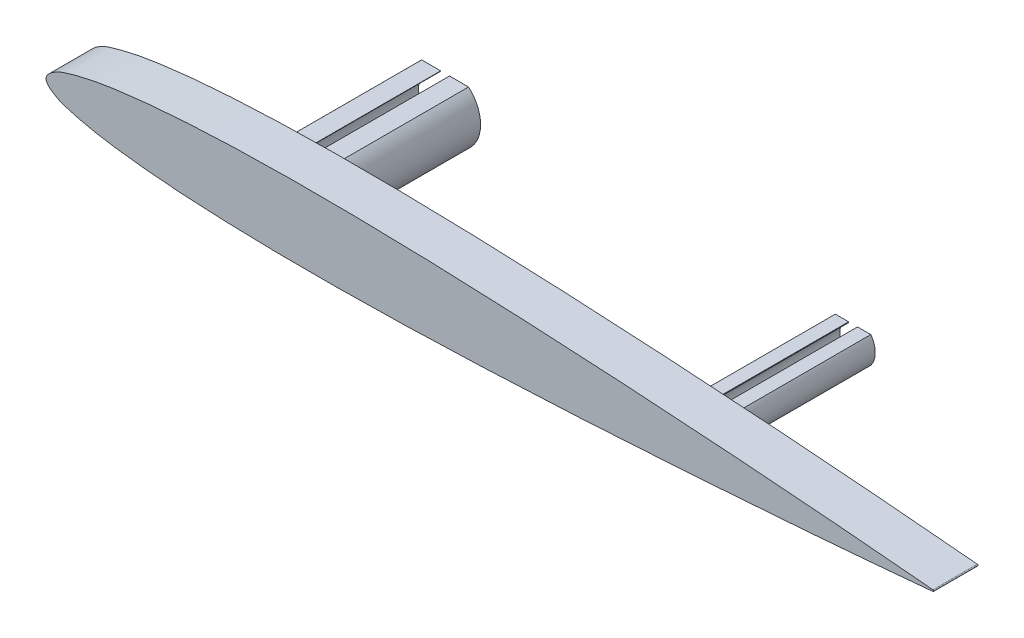
ISO-10303-21;
HEADER;
FILE_DESCRIPTION(('STEP AP214'),'2;1');
FILE_NAME('part.step','',(''),(''),'','','');
FILE_SCHEMA(('AUTOMOTIVE_DESIGN { 1 0 10303 214 1 1 1 1 }'));
ENDSEC;
DATA;
#1=APPLICATION_CONTEXT('core data for automotive mechanical design processes');
#2=APPLICATION_PROTOCOL_DEFINITION('international standard','automotive_design',2000,#1);
#3=PRODUCT_CONTEXT('',#1,'mechanical');
#4=PRODUCT('Part','Part','',(#3));
#5=PRODUCT_RELATED_PRODUCT_CATEGORY('part','',(#4));
#6=PRODUCT_DEFINITION_FORMATION('','',#4);
#7=PRODUCT_DEFINITION_CONTEXT('part definition',#1,'design');
#8=PRODUCT_DEFINITION('design','',#6,#7);
#9=PRODUCT_DEFINITION_SHAPE('','',#8);
#10=(LENGTH_UNIT() NAMED_UNIT(*) SI_UNIT(.MILLI.,.METRE.));
#11=(NAMED_UNIT(*) PLANE_ANGLE_UNIT() SI_UNIT($,.RADIAN.));
#12=(NAMED_UNIT(*) SI_UNIT($,.STERADIAN.) SOLID_ANGLE_UNIT());
#13=UNCERTAINTY_MEASURE_WITH_UNIT(LENGTH_MEASURE(1.E-05),#10,'distance_accuracy_value','');
#14=(GEOMETRIC_REPRESENTATION_CONTEXT(3) GLOBAL_UNCERTAINTY_ASSIGNED_CONTEXT((#13)) GLOBAL_UNIT_ASSIGNED_CONTEXT((#10,
#11,#12)) REPRESENTATION_CONTEXT('',''));
#15=CARTESIAN_POINT('',(0.,0.,0.));
#16=DIRECTION('',(0.,0.,1.));
#17=DIRECTION('',(1.,0.,0.));
#18=AXIS2_PLACEMENT_3D('',#15,#16,#17);
#19=CARTESIAN_POINT('',(0.,0.,0.));
#20=DIRECTION('',(0.,0.,-1.));
#21=DIRECTION('',(-1.,0.,0.));
#22=AXIS2_PLACEMENT_3D('',#19,#20,#21);
#23=PLANE('',#22);
#24=CARTESIAN_POINT('',(25.,0.,0.));
#25=DIRECTION('',(0.,0.,1.));
#26=DIRECTION('',(1.,0.,0.));
#27=AXIS2_PLACEMENT_3D('',#24,#25,#26);
#28=CIRCLE('',#27,4.);
#29=CARTESIAN_POINT('',(27.6457513110646,-3.,0.));
#30=VERTEX_POINT('',#29);
#31=CARTESIAN_POINT('',(27.6457513110646,3.,0.));
#32=VERTEX_POINT('',#31);
#33=EDGE_CURVE('E242',#30,#32,#28,.T.);
#34=ORIENTED_EDGE('',*,*,#33,.T.);
#35=DIRECTION('',(-1.,0.,0.));
#36=VECTOR('',#35,1.);
#37=CARTESIAN_POINT('',(25.5,3.,0.));
#38=LINE('',#37,#36);
#39=CARTESIAN_POINT('',(25.5,3.,0.));
#40=VERTEX_POINT('',#39);
#41=EDGE_CURVE('E211',#32,#40,#38,.T.);
#42=ORIENTED_EDGE('',*,*,#41,.T.);
#43=DIRECTION('',(0.,-1.,0.));
#44=VECTOR('',#43,1.);
#45=CARTESIAN_POINT('',(25.5,2.95803989154981,0.));
#46=LINE('',#45,#44);
#47=CARTESIAN_POINT('',(25.5,2.95803989154981,0.));
#48=VERTEX_POINT('',#47);
#49=EDGE_CURVE('E245',#40,#48,#46,.T.);
#50=ORIENTED_EDGE('',*,*,#49,.T.);
#51=CARTESIAN_POINT('',(25.,0.,0.));
#52=DIRECTION('',(0.,0.,-1.));
#53=DIRECTION('',(1.,0.,0.));
#54=AXIS2_PLACEMENT_3D('',#51,#52,#53);
#55=CIRCLE('',#54,3.);
#56=CARTESIAN_POINT('',(25.5,-2.95803989154981,0.));
#57=VERTEX_POINT('',#56);
#58=EDGE_CURVE('E247',#48,#57,#55,.T.);
#59=ORIENTED_EDGE('',*,*,#58,.T.);
#60=DIRECTION('',(0.,-1.,0.));
#61=VECTOR('',#60,1.);
#62=CARTESIAN_POINT('',(25.5,-3.,0.));
#63=LINE('',#62,#61);
#64=CARTESIAN_POINT('',(25.5,-3.,0.));
#65=VERTEX_POINT('',#64);
#66=EDGE_CURVE('E53',#57,#65,#63,.T.);
#67=ORIENTED_EDGE('',*,*,#66,.T.);
#68=DIRECTION('',(1.,0.,0.));
#69=VECTOR('',#68,1.);
#70=CARTESIAN_POINT('',(25.5,-3.,0.));
#71=LINE('',#70,#69);
#72=EDGE_CURVE('E48',#65,#30,#71,.T.);
#73=ORIENTED_EDGE('',*,*,#72,.T.);
#74=EDGE_LOOP('',(#34,#42,#50,#59,#67,#73));
#75=FACE_BOUND('',#74,.T.);
#76=CARTESIAN_POINT('',(25.,0.,0.));
#77=DIRECTION('',(0.,0.,-1.));
#78=DIRECTION('',(1.,0.,0.));
#79=AXIS2_PLACEMENT_3D('',#76,#77,#78);
#80=CIRCLE('',#79,3.);
#81=CARTESIAN_POINT('',(24.5,-2.95803989154981,0.));
#82=VERTEX_POINT('',#81);
#83=CARTESIAN_POINT('',(24.5,2.95803989154981,0.));
#84=VERTEX_POINT('',#83);
#85=EDGE_CURVE('E251',#82,#84,#80,.T.);
#86=ORIENTED_EDGE('',*,*,#85,.T.);
#87=DIRECTION('',(0.,1.,0.));
#88=VECTOR('',#87,1.);
#89=CARTESIAN_POINT('',(24.5,2.95803989154981,0.));
#90=LINE('',#89,#88);
#91=CARTESIAN_POINT('',(24.5,3.,0.));
#92=VERTEX_POINT('',#91);
#93=EDGE_CURVE('E282',#84,#92,#90,.T.);
#94=ORIENTED_EDGE('',*,*,#93,.T.);
#95=DIRECTION('',(-1.,0.,0.));
#96=VECTOR('',#95,1.);
#97=CARTESIAN_POINT('',(22.3542486889354,3.,0.));
#98=LINE('',#97,#96);
#99=CARTESIAN_POINT('',(22.3542486889354,3.,0.));
#100=VERTEX_POINT('',#99);
#101=EDGE_CURVE('E284',#92,#100,#98,.T.);
#102=ORIENTED_EDGE('',*,*,#101,.T.);
#103=CARTESIAN_POINT('',(25.,0.,0.));
#104=DIRECTION('',(0.,0.,1.));
#105=DIRECTION('',(1.,0.,0.));
#106=AXIS2_PLACEMENT_3D('',#103,#104,#105);
#107=CIRCLE('',#106,4.);
#108=CARTESIAN_POINT('',(22.3542486889354,-3.,0.));
#109=VERTEX_POINT('',#108);
#110=EDGE_CURVE('E286',#100,#109,#107,.T.);
#111=ORIENTED_EDGE('',*,*,#110,.T.);
#112=DIRECTION('',(1.,0.,0.));
#113=VECTOR('',#112,1.);
#114=CARTESIAN_POINT('',(22.3542486889354,-3.,0.));
#115=LINE('',#114,#113);
#116=CARTESIAN_POINT('',(24.5,-3.,0.));
#117=VERTEX_POINT('',#116);
#118=EDGE_CURVE('E288',#109,#117,#115,.T.);
#119=ORIENTED_EDGE('',*,*,#118,.T.);
#120=DIRECTION('',(0.,1.,0.));
#121=VECTOR('',#120,1.);
#122=CARTESIAN_POINT('',(24.5,-3.,0.));
#123=LINE('',#122,#121);
#124=EDGE_CURVE('E265',#117,#82,#123,.T.);
#125=ORIENTED_EDGE('',*,*,#124,.T.);
#126=EDGE_LOOP('',(#86,#94,#102,#111,#119,#125));
#127=FACE_BOUND('',#126,.T.);
#128=CARTESIAN_POINT('',(100.,0.084,0.));
#129=CARTESIAN_POINT('',(98.333488814933,0.236746480055364,0.));
#130=CARTESIAN_POINT('',(95.0011947254255,0.542172688557606,0.));
#131=CARTESIAN_POINT('',(88.3355596211879,1.11089898015662,0.));
#132=CARTESIAN_POINT('',(80.0032933562199,1.76361099520967,0.));
#133=CARTESIAN_POINT('',(70.0029989334555,2.45786169254404,0.));
#134=CARTESIAN_POINT('',(60.0031046254057,3.06174772348002,0.));
#135=CARTESIAN_POINT('',(50.0030086005351,3.55213921170033,0.));
#136=CARTESIAN_POINT('',(40.0025985576922,3.90294649372571,0.));
#137=CARTESIAN_POINT('',(31.666961485844,4.02526015065941,0.));
#138=CARTESIAN_POINT('',(24.9991546003269,3.97693379087482,0.));
#139=CARTESIAN_POINT('',(19.9977755867835,3.84497639830756,0.));
#140=CARTESIAN_POINT('',(14.9933631314586,3.59248695861782,0.));
#141=CARTESIAN_POINT('',(10.8271840648808,3.23765157891607,0.));
#142=CARTESIAN_POINT('',(7.48905438800269,2.81402136675529,0.));
#143=CARTESIAN_POINT('',(4.99359465012965,2.40367305928858,0.));
#144=CARTESIAN_POINT('',(2.84962633983361,1.86792549429032,0.));
#145=CARTESIAN_POINT('',(1.16541350274339,1.32098725183071,0.));
#146=CARTESIAN_POINT('',(-0.664613784127027,0.,0.));
#147=CARTESIAN_POINT('',(1.16541350274339,-1.32098725183071,0.));
#148=CARTESIAN_POINT('',(2.84962633983362,-1.86792549429032,0.));
#149=CARTESIAN_POINT('',(4.99359465012963,-2.40367305928857,0.));
#150=CARTESIAN_POINT('',(7.48905438800269,-2.81402136675529,0.));
#151=CARTESIAN_POINT('',(10.8271840648809,-3.23765157891607,0.));
#152=CARTESIAN_POINT('',(14.9933631314586,-3.59248695861782,0.));
#153=CARTESIAN_POINT('',(19.9977755867835,-3.84497639830756,0.));
#154=CARTESIAN_POINT('',(24.9991546003269,-3.97693379087482,0.));
#155=CARTESIAN_POINT('',(31.666961485844,-4.02526015065941,0.));
#156=CARTESIAN_POINT('',(40.0025985576922,-3.90294649372571,0.));
#157=CARTESIAN_POINT('',(50.0030086005351,-3.55213921170033,0.));
#158=CARTESIAN_POINT('',(60.0031046254058,-3.06174772348002,0.));
#159=CARTESIAN_POINT('',(70.0029989334555,-2.45786169254404,0.));
#160=CARTESIAN_POINT('',(80.0032933562199,-1.76361099520967,0.));
#161=CARTESIAN_POINT('',(88.3355596211879,-1.11089898015662,0.));
#162=CARTESIAN_POINT('',(95.0011947254255,-0.542172688557605,0.));
#163=CARTESIAN_POINT('',(98.333488814933,-0.236746480055364,0.));
#164=CARTESIAN_POINT('',(100.,-0.084,0.));
#165=B_SPLINE_CURVE_WITH_KNOTS('',3,(#128,#129,#130,#131,#132,#133,#134,#135,#136,#137,#138,
#139,#140,#141,#142,#143,#144,#145,#146,#147,#148,#149,#150,#151,#152,#153,#154,#155,#156,#157,
#158,#159,#160,#161,#162,#163,#164),.UNSPECIFIED.,.F.,.F.,(4,1,1,1,1,1,1,1,1,1,1,1,1,1,1,1,1,1,
1,1,1,1,1,1,1,1,1,1,1,1,1,1,1,1,4),(0.,0.0248762929189861,0.0497417146704998,0.0994434021110951,
0.149112224036195,0.198750974066913,0.248359097492202,0.297937369716024,0.347491327096237,
0.37226694027957,0.39705092368842,0.421859474838904,0.446731345826762,0.459220451479859,
0.471790601601357,0.484560454432956,0.491195112481227,0.5,0.508804887518773,0.515439545567044,
0.528209398398643,0.540779548520141,0.553268654173238,0.578140525161096,0.60294907631158,
0.62773305972043,0.652508672903763,0.702062630283976,0.751640902507798,0.801249025933086,
0.850887775963805,0.900556597888905,0.9502582853295,0.975123707081014,1.),.UNSPECIFIED.);
#166=CARTESIAN_POINT('',(100.,0.084,0.));
#167=VERTEX_POINT('',#166);
#168=CARTESIAN_POINT('',(100.,-0.084,0.));
#169=VERTEX_POINT('',#168);
#170=EDGE_CURVE('E393',#167,#169,#165,.T.);
#171=ORIENTED_EDGE('',*,*,#170,.F.);
#172=CARTESIAN_POINT('',(100.,0.,0.));
#173=DIRECTION('',(0.,0.,1.));
#174=DIRECTION('',(-1.,0.,0.));
#175=AXIS2_PLACEMENT_3D('',#172,#173,#174);
#176=CIRCLE('',#175,0.084);
#177=EDGE_CURVE('E401',#169,#167,#176,.T.);
#178=ORIENTED_EDGE('',*,*,#177,.F.);
#179=EDGE_LOOP('',(#171,#178));
#180=FACE_BOUND('',#179,.T.);
#181=DIRECTION('',(1.,0.,0.));
#182=VECTOR('',#181,1.);
#183=CARTESIAN_POINT('',(69.,1.5,0.));
#184=LINE('',#183,#182);
#185=CARTESIAN_POINT('',(69.,1.5,0.));
#186=VERTEX_POINT('',#185);
#187=CARTESIAN_POINT('',(70.5,1.5,0.));
#188=VERTEX_POINT('',#187);
#189=EDGE_CURVE('E369',#186,#188,#184,.T.);
#190=ORIENTED_EDGE('',*,*,#189,.F.);
#191=CARTESIAN_POINT('',(71.,0.,0.));
#192=DIRECTION('',(0.,0.,-1.));
#193=DIRECTION('',(-1.,0.,0.));
#194=AXIS2_PLACEMENT_3D('',#191,#192,#193);
#195=CIRCLE('',#194,2.5);
#196=CARTESIAN_POINT('',(69.,-1.5,0.));
#197=VERTEX_POINT('',#196);
#198=EDGE_CURVE('E351',#197,#186,#195,.T.);
#199=ORIENTED_EDGE('',*,*,#198,.F.);
#200=DIRECTION('',(-1.,0.,0.));
#201=VECTOR('',#200,1.);
#202=CARTESIAN_POINT('',(69.,-1.5,0.));
#203=LINE('',#202,#201);
#204=CARTESIAN_POINT('',(70.5,-1.5,0.));
#205=VERTEX_POINT('',#204);
#206=EDGE_CURVE('E356',#205,#197,#203,.T.);
#207=ORIENTED_EDGE('',*,*,#206,.F.);
#208=DIRECTION('',(0.,-1.,0.));
#209=VECTOR('',#208,1.);
#210=CARTESIAN_POINT('',(70.5,-1.5,0.));
#211=LINE('',#210,#209);
#212=CARTESIAN_POINT('',(70.5,-1.41421356237309,0.));
#213=VERTEX_POINT('',#212);
#214=EDGE_CURVE('E375',#213,#205,#211,.T.);
#215=ORIENTED_EDGE('',*,*,#214,.F.);
#216=CARTESIAN_POINT('',(71.,0.,0.));
#217=DIRECTION('',(0.,0.,1.));
#218=DIRECTION('',(-1.,0.,0.));
#219=AXIS2_PLACEMENT_3D('',#216,#217,#218);
#220=CIRCLE('',#219,1.5);
#221=CARTESIAN_POINT('',(70.5,1.41421356237309,0.));
#222=VERTEX_POINT('',#221);
#223=EDGE_CURVE('E373',#222,#213,#220,.T.);
#224=ORIENTED_EDGE('',*,*,#223,.F.);
#225=DIRECTION('',(0.,-1.,0.));
#226=VECTOR('',#225,1.);
#227=CARTESIAN_POINT('',(70.5,1.41421356237309,0.));
#228=LINE('',#227,#226);
#229=EDGE_CURVE('E371',#188,#222,#228,.T.);
#230=ORIENTED_EDGE('',*,*,#229,.F.);
#231=EDGE_LOOP('',(#190,#199,#207,#215,#224,#230));
#232=FACE_BOUND('',#231,.T.);
#233=CARTESIAN_POINT('',(71.,0.,0.));
#234=DIRECTION('',(0.,0.,-1.));
#235=DIRECTION('',(-1.,0.,0.));
#236=AXIS2_PLACEMENT_3D('',#233,#234,#235);
#237=CIRCLE('',#236,2.5);
#238=CARTESIAN_POINT('',(73.,1.5,0.));
#239=VERTEX_POINT('',#238);
#240=CARTESIAN_POINT('',(73.,-1.5,0.));
#241=VERTEX_POINT('',#240);
#242=EDGE_CURVE('E326',#239,#241,#237,.T.);
#243=ORIENTED_EDGE('',*,*,#242,.F.);
#244=DIRECTION('',(1.,0.,0.));
#245=VECTOR('',#244,1.);
#246=CARTESIAN_POINT('',(71.5,1.5,0.));
#247=LINE('',#246,#245);
#248=CARTESIAN_POINT('',(71.5,1.5,0.));
#249=VERTEX_POINT('',#248);
#250=EDGE_CURVE('E294',#249,#239,#247,.T.);
#251=ORIENTED_EDGE('',*,*,#250,.F.);
#252=DIRECTION('',(1.61771349781083E-13,1.,0.));
#253=VECTOR('',#252,1.);
#254=CARTESIAN_POINT('',(71.5,1.4142135623731,0.));
#255=LINE('',#254,#253);
#256=CARTESIAN_POINT('',(71.5,1.4142135623731,0.));
#257=VERTEX_POINT('',#256);
#258=EDGE_CURVE('E313',#257,#249,#255,.T.);
#259=ORIENTED_EDGE('',*,*,#258,.F.);
#260=CARTESIAN_POINT('',(71.,0.,0.));
#261=DIRECTION('',(0.,0.,1.));
#262=DIRECTION('',(-1.,0.,0.));
#263=AXIS2_PLACEMENT_3D('',#260,#261,#262);
#264=CIRCLE('',#263,1.5);
#265=CARTESIAN_POINT('',(71.5,-1.4142135623731,0.));
#266=VERTEX_POINT('',#265);
#267=EDGE_CURVE('E332',#266,#257,#264,.T.);
#268=ORIENTED_EDGE('',*,*,#267,.F.);
#269=DIRECTION('',(0.,1.,0.));
#270=VECTOR('',#269,1.);
#271=CARTESIAN_POINT('',(71.5,-1.5,0.));
#272=LINE('',#271,#270);
#273=CARTESIAN_POINT('',(71.5,-1.5,0.));
#274=VERTEX_POINT('',#273);
#275=EDGE_CURVE('E330',#274,#266,#272,.T.);
#276=ORIENTED_EDGE('',*,*,#275,.F.);
#277=DIRECTION('',(-1.,0.,0.));
#278=VECTOR('',#277,1.);
#279=CARTESIAN_POINT('',(71.5,-1.5,0.));
#280=LINE('',#279,#278);
#281=EDGE_CURVE('E328',#241,#274,#280,.T.);
#282=ORIENTED_EDGE('',*,*,#281,.F.);
#283=EDGE_LOOP('',(#243,#251,#259,#268,#276,#282));
#284=FACE_BOUND('',#283,.T.);
#285=ADVANCED_FACE('F32',(#75,#127,#180,#232,#284),#23,.T.);
#286=CARTESIAN_POINT('',(100.,0.084,5.));
#287=CARTESIAN_POINT('',(98.333488814933,0.236746480055364,5.));
#288=CARTESIAN_POINT('',(95.0011947254255,0.542172688557606,5.));
#289=CARTESIAN_POINT('',(88.3355596211879,1.11089898015662,5.));
#290=CARTESIAN_POINT('',(80.0032933562199,1.76361099520967,5.));
#291=CARTESIAN_POINT('',(70.0029989334555,2.45786169254404,5.));
#292=CARTESIAN_POINT('',(60.0031046254057,3.06174772348002,5.));
#293=CARTESIAN_POINT('',(50.0030086005351,3.55213921170033,5.));
#294=CARTESIAN_POINT('',(40.0025985576922,3.90294649372571,5.));
#295=CARTESIAN_POINT('',(31.666961485844,4.02526015065941,5.));
#296=CARTESIAN_POINT('',(24.9991546003269,3.97693379087482,5.));
#297=CARTESIAN_POINT('',(19.9977755867835,3.84497639830756,5.));
#298=CARTESIAN_POINT('',(14.9933631314586,3.59248695861782,5.));
#299=CARTESIAN_POINT('',(10.8271840648808,3.23765157891607,5.));
#300=CARTESIAN_POINT('',(7.48905438800269,2.81402136675529,5.));
#301=CARTESIAN_POINT('',(4.99359465012965,2.40367305928858,5.));
#302=CARTESIAN_POINT('',(2.84962633983361,1.86792549429032,5.));
#303=CARTESIAN_POINT('',(1.16541350274339,1.32098725183071,5.));
#304=CARTESIAN_POINT('',(-0.664613784127027,0.,5.));
#305=CARTESIAN_POINT('',(1.16541350274339,-1.32098725183071,5.));
#306=CARTESIAN_POINT('',(2.84962633983362,-1.86792549429032,5.));
#307=CARTESIAN_POINT('',(4.99359465012963,-2.40367305928857,5.));
#308=CARTESIAN_POINT('',(7.48905438800269,-2.81402136675529,5.));
#309=CARTESIAN_POINT('',(10.8271840648809,-3.23765157891607,5.));
#310=CARTESIAN_POINT('',(14.9933631314586,-3.59248695861782,5.));
#311=CARTESIAN_POINT('',(19.9977755867835,-3.84497639830756,5.));
#312=CARTESIAN_POINT('',(24.9991546003269,-3.97693379087482,5.));
#313=CARTESIAN_POINT('',(31.666961485844,-4.02526015065941,5.));
#314=CARTESIAN_POINT('',(40.0025985576922,-3.90294649372571,5.));
#315=CARTESIAN_POINT('',(50.0030086005351,-3.55213921170033,5.));
#316=CARTESIAN_POINT('',(60.0031046254058,-3.06174772348002,5.));
#317=CARTESIAN_POINT('',(70.0029989334555,-2.45786169254404,5.));
#318=CARTESIAN_POINT('',(80.0032933562199,-1.76361099520967,5.));
#319=CARTESIAN_POINT('',(88.3355596211879,-1.11089898015662,5.));
#320=CARTESIAN_POINT('',(95.0011947254255,-0.542172688557605,5.));
#321=CARTESIAN_POINT('',(98.333488814933,-0.236746480055364,5.));
#322=CARTESIAN_POINT('',(100.,-0.084,5.));
#323=B_SPLINE_CURVE_WITH_KNOTS('',3,(#286,#287,#288,#289,#290,#291,#292,#293,#294,#295,#296,
#297,#298,#299,#300,#301,#302,#303,#304,#305,#306,#307,#308,#309,#310,#311,#312,#313,#314,#315,
#316,#317,#318,#319,#320,#321,#322),.UNSPECIFIED.,.F.,.F.,(4,1,1,1,1,1,1,1,1,1,1,1,1,1,1,1,1,1,
1,1,1,1,1,1,1,1,1,1,1,1,1,1,1,1,4),(0.,0.0248762929189861,0.0497417146704998,0.0994434021110951,
0.149112224036195,0.198750974066913,0.248359097492202,0.297937369716024,0.347491327096237,
0.37226694027957,0.39705092368842,0.421859474838904,0.446731345826762,0.459220451479859,
0.471790601601357,0.484560454432956,0.491195112481227,0.5,0.508804887518773,0.515439545567044,
0.528209398398643,0.540779548520141,0.553268654173238,0.578140525161096,0.60294907631158,
0.62773305972043,0.652508672903763,0.702062630283976,0.751640902507798,0.801249025933086,
0.850887775963805,0.900556597888905,0.9502582853295,0.975123707081014,1.),.UNSPECIFIED.);
#324=DIRECTION('',(0.,0.,-1.));
#325=VECTOR('',#324,1.);
#326=SURFACE_OF_LINEAR_EXTRUSION('',#323,#325);
#327=ORIENTED_EDGE('',*,*,#170,.T.);
#328=DIRECTION('',(0.,0.,-1.));
#329=VECTOR('',#328,1.);
#330=CARTESIAN_POINT('',(100.,-0.084,5.));
#331=LINE('',#330,#329);
#332=CARTESIAN_POINT('',(100.,-0.084,5.));
#333=VERTEX_POINT('',#332);
#334=EDGE_CURVE('E11',#333,#169,#331,.T.);
#335=ORIENTED_EDGE('',*,*,#334,.F.);
#336=CARTESIAN_POINT('',(100.,0.084,5.));
#337=VERTEX_POINT('',#336);
#338=EDGE_CURVE('E394',#337,#333,#323,.T.);
#339=ORIENTED_EDGE('',*,*,#338,.F.);
#340=DIRECTION('',(0.,0.,-1.));
#341=VECTOR('',#340,1.);
#342=CARTESIAN_POINT('',(100.,0.084,5.));
#343=LINE('',#342,#341);
#344=EDGE_CURVE('E41',#337,#167,#343,.T.);
#345=ORIENTED_EDGE('',*,*,#344,.T.);
#346=EDGE_LOOP('',(#327,#335,#339,#345));
#347=FACE_BOUND('',#346,.T.);
#348=ADVANCED_FACE('F34',(#347),#326,.F.);
#349=CARTESIAN_POINT('',(100.,0.,5.));
#350=DIRECTION('',(0.,0.,-1.));
#351=DIRECTION('',(-1.,0.,0.));
#352=AXIS2_PLACEMENT_3D('',#349,#350,#351);
#353=CYLINDRICAL_SURFACE('',#352,0.084);
#354=ORIENTED_EDGE('',*,*,#177,.T.);
#355=ORIENTED_EDGE('',*,*,#344,.F.);
#356=CARTESIAN_POINT('',(100.,0.,5.));
#357=DIRECTION('',(0.,0.,1.));
#358=DIRECTION('',(-1.,0.,0.));
#359=AXIS2_PLACEMENT_3D('',#356,#357,#358);
#360=CIRCLE('',#359,0.084);
#361=EDGE_CURVE('E400',#333,#337,#360,.T.);
#362=ORIENTED_EDGE('',*,*,#361,.F.);
#363=ORIENTED_EDGE('',*,*,#334,.T.);
#364=EDGE_LOOP('',(#354,#355,#362,#363));
#365=FACE_BOUND('',#364,.T.);
#366=ADVANCED_FACE('F422',(#365),#353,.T.);
#367=CARTESIAN_POINT('',(0.,0.,5.));
#368=DIRECTION('',(0.,0.,-1.));
#369=DIRECTION('',(-1.,0.,0.));
#370=AXIS2_PLACEMENT_3D('',#367,#368,#369);
#371=PLANE('',#370);
#372=ORIENTED_EDGE('',*,*,#338,.T.);
#373=ORIENTED_EDGE('',*,*,#361,.T.);
#374=EDGE_LOOP('',(#372,#373));
#375=FACE_BOUND('',#374,.T.);
#376=ADVANCED_FACE('F424',(#375),#371,.F.);
#377=CARTESIAN_POINT('',(71.,0.,-15.));
#378=DIRECTION('',(0.,0.,1.));
#379=DIRECTION('',(1.,0.,0.));
#380=AXIS2_PLACEMENT_3D('',#377,#378,#379);
#381=CYLINDRICAL_SURFACE('',#380,2.5);
#382=ORIENTED_EDGE('',*,*,#198,.T.);
#383=DIRECTION('',(0.,0.,1.));
#384=VECTOR('',#383,1.);
#385=CARTESIAN_POINT('',(69.,1.5,-15.));
#386=LINE('',#385,#384);
#387=CARTESIAN_POINT('',(69.,1.5,-15.));
#388=VERTEX_POINT('',#387);
#389=EDGE_CURVE('E392',#388,#186,#386,.T.);
#390=ORIENTED_EDGE('',*,*,#389,.F.);
#391=CARTESIAN_POINT('',(71.,0.,-15.));
#392=DIRECTION('',(0.,0.,-1.));
#393=DIRECTION('',(-1.,0.,0.));
#394=AXIS2_PLACEMENT_3D('',#391,#392,#393);
#395=CIRCLE('',#394,2.5);
#396=CARTESIAN_POINT('',(69.,-1.5,-15.));
#397=VERTEX_POINT('',#396);
#398=EDGE_CURVE('E352',#397,#388,#395,.T.);
#399=ORIENTED_EDGE('',*,*,#398,.F.);
#400=DIRECTION('',(0.,0.,1.));
#401=VECTOR('',#400,1.);
#402=CARTESIAN_POINT('',(69.,-1.5,-15.));
#403=LINE('',#402,#401);
#404=EDGE_CURVE('E366',#397,#197,#403,.T.);
#405=ORIENTED_EDGE('',*,*,#404,.T.);
#406=EDGE_LOOP('',(#382,#390,#399,#405));
#407=FACE_BOUND('',#406,.T.);
#408=ADVANCED_FACE('F426',(#407),#381,.T.);
#409=CARTESIAN_POINT('',(69.,1.5,-15.));
#410=DIRECTION('',(0.,-1.,0.));
#411=DIRECTION('',(1.,0.,0.));
#412=AXIS2_PLACEMENT_3D('',#409,#410,#411);
#413=PLANE('',#412);
#414=ORIENTED_EDGE('',*,*,#189,.T.);
#415=DIRECTION('',(0.,0.,1.));
#416=VECTOR('',#415,1.);
#417=CARTESIAN_POINT('',(70.5,1.5,-15.));
#418=LINE('',#417,#416);
#419=CARTESIAN_POINT('',(70.5,1.5,-15.));
#420=VERTEX_POINT('',#419);
#421=EDGE_CURVE('E389',#420,#188,#418,.T.);
#422=ORIENTED_EDGE('',*,*,#421,.F.);
#423=DIRECTION('',(1.,0.,0.));
#424=VECTOR('',#423,1.);
#425=CARTESIAN_POINT('',(69.,1.5,-15.));
#426=LINE('',#425,#424);
#427=EDGE_CURVE('E355',#388,#420,#426,.T.);
#428=ORIENTED_EDGE('',*,*,#427,.F.);
#429=ORIENTED_EDGE('',*,*,#389,.T.);
#430=EDGE_LOOP('',(#414,#422,#428,#429));
#431=FACE_BOUND('',#430,.T.);
#432=ADVANCED_FACE('F432',(#431),#413,.F.);
#433=CARTESIAN_POINT('',(70.5,1.41421356237309,-15.));
#434=DIRECTION('',(-1.,0.,0.));
#435=DIRECTION('',(0.,0.,1.));
#436=AXIS2_PLACEMENT_3D('',#433,#434,#435);
#437=PLANE('',#436);
#438=ORIENTED_EDGE('',*,*,#229,.T.);
#439=DIRECTION('',(0.,0.,1.));
#440=VECTOR('',#439,1.);
#441=CARTESIAN_POINT('',(70.5,1.41421356237309,-15.));
#442=LINE('',#441,#440);
#443=CARTESIAN_POINT('',(70.5,1.41421356237309,-15.));
#444=VERTEX_POINT('',#443);
#445=EDGE_CURVE('E386',#444,#222,#442,.T.);
#446=ORIENTED_EDGE('',*,*,#445,.F.);
#447=DIRECTION('',(0.,-1.,0.));
#448=VECTOR('',#447,1.);
#449=CARTESIAN_POINT('',(70.5,1.41421356237309,-15.));
#450=LINE('',#449,#448);
#451=EDGE_CURVE('E358',#420,#444,#450,.T.);
#452=ORIENTED_EDGE('',*,*,#451,.F.);
#453=ORIENTED_EDGE('',*,*,#421,.T.);
#454=EDGE_LOOP('',(#438,#446,#452,#453));
#455=FACE_BOUND('',#454,.T.);
#456=ADVANCED_FACE('F531',(#455),#437,.F.);
#457=CARTESIAN_POINT('',(71.,0.,-15.));
#458=DIRECTION('',(0.,0.,1.));
#459=DIRECTION('',(1.,0.,0.));
#460=AXIS2_PLACEMENT_3D('',#457,#458,#459);
#461=CYLINDRICAL_SURFACE('',#460,1.5);
#462=ORIENTED_EDGE('',*,*,#223,.T.);
#463=DIRECTION('',(0.,0.,1.));
#464=VECTOR('',#463,1.);
#465=CARTESIAN_POINT('',(70.5,-1.41421356237309,-15.));
#466=LINE('',#465,#464);
#467=CARTESIAN_POINT('',(70.5,-1.41421356237309,-15.));
#468=VERTEX_POINT('',#467);
#469=EDGE_CURVE('E383',#468,#213,#466,.T.);
#470=ORIENTED_EDGE('',*,*,#469,.F.);
#471=CARTESIAN_POINT('',(71.,0.,-15.));
#472=DIRECTION('',(0.,0.,1.));
#473=DIRECTION('',(-1.,0.,0.));
#474=AXIS2_PLACEMENT_3D('',#471,#472,#473);
#475=CIRCLE('',#474,1.5);
#476=EDGE_CURVE('E360',#444,#468,#475,.T.);
#477=ORIENTED_EDGE('',*,*,#476,.F.);
#478=ORIENTED_EDGE('',*,*,#445,.T.);
#479=EDGE_LOOP('',(#462,#470,#477,#478));
#480=FACE_BOUND('',#479,.T.);
#481=ADVANCED_FACE('F527',(#480),#461,.F.);
#482=CARTESIAN_POINT('',(70.5,-1.5,-15.));
#483=DIRECTION('',(-1.,0.,0.));
#484=DIRECTION('',(0.,0.,1.));
#485=AXIS2_PLACEMENT_3D('',#482,#483,#484);
#486=PLANE('',#485);
#487=ORIENTED_EDGE('',*,*,#214,.T.);
#488=DIRECTION('',(0.,0.,1.));
#489=VECTOR('',#488,1.);
#490=CARTESIAN_POINT('',(70.5,-1.5,-15.));
#491=LINE('',#490,#489);
#492=CARTESIAN_POINT('',(70.5,-1.5,-15.));
#493=VERTEX_POINT('',#492);
#494=EDGE_CURVE('E381',#493,#205,#491,.T.);
#495=ORIENTED_EDGE('',*,*,#494,.F.);
#496=DIRECTION('',(0.,-1.,0.));
#497=VECTOR('',#496,1.);
#498=CARTESIAN_POINT('',(70.5,-1.5,-15.));
#499=LINE('',#498,#497);
#500=EDGE_CURVE('E362',#468,#493,#499,.T.);
#501=ORIENTED_EDGE('',*,*,#500,.F.);
#502=ORIENTED_EDGE('',*,*,#469,.T.);
#503=EDGE_LOOP('',(#487,#495,#501,#502));
#504=FACE_BOUND('',#503,.T.);
#505=ADVANCED_FACE('F523',(#504),#486,.F.);
#506=CARTESIAN_POINT('',(69.,-1.5,-15.));
#507=DIRECTION('',(0.,1.,0.));
#508=DIRECTION('',(0.,0.,1.));
#509=AXIS2_PLACEMENT_3D('',#506,#507,#508);
#510=PLANE('',#509);
#511=ORIENTED_EDGE('',*,*,#206,.T.);
#512=ORIENTED_EDGE('',*,*,#404,.F.);
#513=DIRECTION('',(-1.,0.,0.));
#514=VECTOR('',#513,1.);
#515=CARTESIAN_POINT('',(69.,-1.5,-15.));
#516=LINE('',#515,#514);
#517=EDGE_CURVE('E364',#493,#397,#516,.T.);
#518=ORIENTED_EDGE('',*,*,#517,.F.);
#519=ORIENTED_EDGE('',*,*,#494,.T.);
#520=EDGE_LOOP('',(#511,#512,#518,#519));
#521=FACE_BOUND('',#520,.T.);
#522=ADVANCED_FACE('F519',(#521),#510,.F.);
#523=CARTESIAN_POINT('',(71.,0.,-15.));
#524=DIRECTION('',(0.,0.,-1.));
#525=DIRECTION('',(-1.,0.,0.));
#526=AXIS2_PLACEMENT_3D('',#523,#524,#525);
#527=PLANE('',#526);
#528=ORIENTED_EDGE('',*,*,#398,.T.);
#529=ORIENTED_EDGE('',*,*,#427,.T.);
#530=ORIENTED_EDGE('',*,*,#451,.T.);
#531=ORIENTED_EDGE('',*,*,#476,.T.);
#532=ORIENTED_EDGE('',*,*,#500,.T.);
#533=ORIENTED_EDGE('',*,*,#517,.T.);
#534=EDGE_LOOP('',(#528,#529,#530,#531,#532,#533));
#535=FACE_BOUND('',#534,.T.);
#536=ADVANCED_FACE('F515',(#535),#527,.T.);
#537=CARTESIAN_POINT('',(71.5,1.5,-15.));
#538=DIRECTION('',(0.,-1.,0.));
#539=DIRECTION('',(1.,0.,0.));
#540=AXIS2_PLACEMENT_3D('',#537,#538,#539);
#541=PLANE('',#540);
#542=ORIENTED_EDGE('',*,*,#250,.T.);
#543=DIRECTION('',(0.,0.,1.));
#544=VECTOR('',#543,1.);
#545=CARTESIAN_POINT('',(73.,1.5,-15.));
#546=LINE('',#545,#544);
#547=CARTESIAN_POINT('',(73.,1.5,-15.));
#548=VERTEX_POINT('',#547);
#549=EDGE_CURVE('E349',#548,#239,#546,.T.);
#550=ORIENTED_EDGE('',*,*,#549,.F.);
#551=DIRECTION('',(1.,0.,0.));
#552=VECTOR('',#551,1.);
#553=CARTESIAN_POINT('',(71.5,1.5,-15.));
#554=LINE('',#553,#552);
#555=CARTESIAN_POINT('',(71.5,1.5,-15.));
#556=VERTEX_POINT('',#555);
#557=EDGE_CURVE('E309',#556,#548,#554,.T.);
#558=ORIENTED_EDGE('',*,*,#557,.F.);
#559=DIRECTION('',(0.,0.,1.));
#560=VECTOR('',#559,1.);
#561=CARTESIAN_POINT('',(71.5,1.5,-15.));
#562=LINE('',#561,#560);
#563=EDGE_CURVE('E323',#556,#249,#562,.T.);
#564=ORIENTED_EDGE('',*,*,#563,.T.);
#565=EDGE_LOOP('',(#542,#550,#558,#564));
#566=FACE_BOUND('',#565,.T.);
#567=ADVANCED_FACE('F511',(#566),#541,.F.);
#568=CARTESIAN_POINT('',(71.,0.,-15.));
#569=DIRECTION('',(0.,0.,1.));
#570=DIRECTION('',(1.,0.,0.));
#571=AXIS2_PLACEMENT_3D('',#568,#569,#570);
#572=CYLINDRICAL_SURFACE('',#571,2.5);
#573=ORIENTED_EDGE('',*,*,#242,.T.);
#574=DIRECTION('',(0.,0.,1.));
#575=VECTOR('',#574,1.);
#576=CARTESIAN_POINT('',(73.,-1.5,-15.));
#577=LINE('',#576,#575);
#578=CARTESIAN_POINT('',(73.,-1.5,-15.));
#579=VERTEX_POINT('',#578);
#580=EDGE_CURVE('E346',#579,#241,#577,.T.);
#581=ORIENTED_EDGE('',*,*,#580,.F.);
#582=CARTESIAN_POINT('',(71.,0.,-15.));
#583=DIRECTION('',(0.,0.,-1.));
#584=DIRECTION('',(-1.,0.,0.));
#585=AXIS2_PLACEMENT_3D('',#582,#583,#584);
#586=CIRCLE('',#585,2.5);
#587=EDGE_CURVE('E312',#548,#579,#586,.T.);
#588=ORIENTED_EDGE('',*,*,#587,.F.);
#589=ORIENTED_EDGE('',*,*,#549,.T.);
#590=EDGE_LOOP('',(#573,#581,#588,#589));
#591=FACE_BOUND('',#590,.T.);
#592=ADVANCED_FACE('F507',(#591),#572,.T.);
#593=CARTESIAN_POINT('',(71.5,-1.5,-15.));
#594=DIRECTION('',(0.,1.,0.));
#595=DIRECTION('',(-1.,0.,0.));
#596=AXIS2_PLACEMENT_3D('',#593,#594,#595);
#597=PLANE('',#596);
#598=ORIENTED_EDGE('',*,*,#281,.T.);
#599=DIRECTION('',(0.,0.,1.));
#600=VECTOR('',#599,1.);
#601=CARTESIAN_POINT('',(71.5,-1.5,-15.));
#602=LINE('',#601,#600);
#603=CARTESIAN_POINT('',(71.5,-1.5,-15.));
#604=VERTEX_POINT('',#603);
#605=EDGE_CURVE('E343',#604,#274,#602,.T.);
#606=ORIENTED_EDGE('',*,*,#605,.F.);
#607=DIRECTION('',(-1.,0.,0.));
#608=VECTOR('',#607,1.);
#609=CARTESIAN_POINT('',(71.5,-1.5,-15.));
#610=LINE('',#609,#608);
#611=EDGE_CURVE('E315',#579,#604,#610,.T.);
#612=ORIENTED_EDGE('',*,*,#611,.F.);
#613=ORIENTED_EDGE('',*,*,#580,.T.);
#614=EDGE_LOOP('',(#598,#606,#612,#613));
#615=FACE_BOUND('',#614,.T.);
#616=ADVANCED_FACE('F503',(#615),#597,.F.);
#617=CARTESIAN_POINT('',(71.5,-1.5,-15.));
#618=DIRECTION('',(1.,0.,0.));
#619=DIRECTION('',(0.,0.,-1.));
#620=AXIS2_PLACEMENT_3D('',#617,#618,#619);
#621=PLANE('',#620);
#622=ORIENTED_EDGE('',*,*,#275,.T.);
#623=DIRECTION('',(0.,0.,1.));
#624=VECTOR('',#623,1.);
#625=CARTESIAN_POINT('',(71.5,-1.4142135623731,-15.));
#626=LINE('',#625,#624);
#627=CARTESIAN_POINT('',(71.5,-1.4142135623731,-15.));
#628=VERTEX_POINT('',#627);
#629=EDGE_CURVE('E340',#628,#266,#626,.T.);
#630=ORIENTED_EDGE('',*,*,#629,.F.);
#631=DIRECTION('',(0.,1.,0.));
#632=VECTOR('',#631,1.);
#633=CARTESIAN_POINT('',(71.5,-1.5,-15.));
#634=LINE('',#633,#632);
#635=EDGE_CURVE('E317',#604,#628,#634,.T.);
#636=ORIENTED_EDGE('',*,*,#635,.F.);
#637=ORIENTED_EDGE('',*,*,#605,.T.);
#638=EDGE_LOOP('',(#622,#630,#636,#637));
#639=FACE_BOUND('',#638,.T.);
#640=ADVANCED_FACE('F499',(#639),#621,.F.);
#641=CARTESIAN_POINT('',(71.,0.,-15.));
#642=DIRECTION('',(0.,0.,1.));
#643=DIRECTION('',(1.,0.,0.));
#644=AXIS2_PLACEMENT_3D('',#641,#642,#643);
#645=CYLINDRICAL_SURFACE('',#644,1.5);
#646=ORIENTED_EDGE('',*,*,#267,.T.);
#647=DIRECTION('',(0.,0.,1.));
#648=VECTOR('',#647,1.);
#649=CARTESIAN_POINT('',(71.5,1.4142135623731,-15.));
#650=LINE('',#649,#648);
#651=CARTESIAN_POINT('',(71.5,1.4142135623731,-15.));
#652=VERTEX_POINT('',#651);
#653=EDGE_CURVE('E338',#652,#257,#650,.T.);
#654=ORIENTED_EDGE('',*,*,#653,.F.);
#655=CARTESIAN_POINT('',(71.,0.,-15.));
#656=DIRECTION('',(0.,0.,1.));
#657=DIRECTION('',(-1.,0.,0.));
#658=AXIS2_PLACEMENT_3D('',#655,#656,#657);
#659=CIRCLE('',#658,1.5);
#660=EDGE_CURVE('E319',#628,#652,#659,.T.);
#661=ORIENTED_EDGE('',*,*,#660,.F.);
#662=ORIENTED_EDGE('',*,*,#629,.T.);
#663=EDGE_LOOP('',(#646,#654,#661,#662));
#664=FACE_BOUND('',#663,.T.);
#665=ADVANCED_FACE('F495',(#664),#645,.F.);
#666=CARTESIAN_POINT('',(71.5,1.4142135623731,-15.));
#667=DIRECTION('',(1.,-1.61771349781083E-13,0.));
#668=DIRECTION('',(1.61771349781083E-13,1.,0.));
#669=AXIS2_PLACEMENT_3D('',#666,#667,#668);
#670=PLANE('',#669);
#671=ORIENTED_EDGE('',*,*,#258,.T.);
#672=ORIENTED_EDGE('',*,*,#563,.F.);
#673=DIRECTION('',(1.61771349781083E-13,1.,0.));
#674=VECTOR('',#673,1.);
#675=CARTESIAN_POINT('',(71.5,1.4142135623731,-15.));
#676=LINE('',#675,#674);
#677=EDGE_CURVE('E321',#652,#556,#676,.T.);
#678=ORIENTED_EDGE('',*,*,#677,.F.);
#679=ORIENTED_EDGE('',*,*,#653,.T.);
#680=EDGE_LOOP('',(#671,#672,#678,#679));
#681=FACE_BOUND('',#680,.T.);
#682=ADVANCED_FACE('F491',(#681),#670,.F.);
#683=CARTESIAN_POINT('',(71.,0.,-15.));
#684=DIRECTION('',(0.,0.,-1.));
#685=DIRECTION('',(-1.,0.,0.));
#686=AXIS2_PLACEMENT_3D('',#683,#684,#685);
#687=PLANE('',#686);
#688=ORIENTED_EDGE('',*,*,#557,.T.);
#689=ORIENTED_EDGE('',*,*,#587,.T.);
#690=ORIENTED_EDGE('',*,*,#611,.T.);
#691=ORIENTED_EDGE('',*,*,#635,.T.);
#692=ORIENTED_EDGE('',*,*,#660,.T.);
#693=ORIENTED_EDGE('',*,*,#677,.T.);
#694=EDGE_LOOP('',(#688,#689,#690,#691,#692,#693));
#695=FACE_BOUND('',#694,.T.);
#696=ADVANCED_FACE('F488',(#695),#687,.T.);
#697=CARTESIAN_POINT('',(25.,0.,-15.));
#698=DIRECTION('',(0.,0.,1.));
#699=DIRECTION('',(1.,0.,0.));
#700=AXIS2_PLACEMENT_3D('',#697,#698,#699);
#701=CYLINDRICAL_SURFACE('',#700,3.);
#702=ORIENTED_EDGE('',*,*,#85,.F.);
#703=DIRECTION('',(0.,0.,1.));
#704=VECTOR('',#703,1.);
#705=CARTESIAN_POINT('',(24.5,-2.95803989154981,-15.));
#706=LINE('',#705,#704);
#707=CARTESIAN_POINT('',(24.5,-2.95803989154981,-15.));
#708=VERTEX_POINT('',#707);
#709=EDGE_CURVE('E291',#708,#82,#706,.T.);
#710=ORIENTED_EDGE('',*,*,#709,.F.);
#711=CARTESIAN_POINT('',(25.,0.,-15.));
#712=DIRECTION('',(0.,0.,-1.));
#713=DIRECTION('',(1.,0.,0.));
#714=AXIS2_PLACEMENT_3D('',#711,#712,#713);
#715=CIRCLE('',#714,3.);
#716=CARTESIAN_POINT('',(24.5,2.95803989154981,-15.));
#717=VERTEX_POINT('',#716);
#718=EDGE_CURVE('E261',#708,#717,#715,.T.);
#719=ORIENTED_EDGE('',*,*,#718,.T.);
#720=DIRECTION('',(0.,0.,1.));
#721=VECTOR('',#720,1.);
#722=CARTESIAN_POINT('',(24.5,2.95803989154981,-15.));
#723=LINE('',#722,#721);
#724=EDGE_CURVE('E280',#717,#84,#723,.T.);
#725=ORIENTED_EDGE('',*,*,#724,.T.);
#726=EDGE_LOOP('',(#702,#710,#719,#725));
#727=FACE_BOUND('',#726,.T.);
#728=ADVANCED_FACE('F445',(#727),#701,.F.);
#729=CARTESIAN_POINT('',(24.5,-3.,-15.));
#730=DIRECTION('',(1.,0.,0.));
#731=DIRECTION('',(0.,0.,-1.));
#732=AXIS2_PLACEMENT_3D('',#729,#730,#731);
#733=PLANE('',#732);
#734=ORIENTED_EDGE('',*,*,#124,.F.);
#735=DIRECTION('',(0.,0.,1.));
#736=VECTOR('',#735,1.);
#737=CARTESIAN_POINT('',(24.5,-3.,-15.));
#738=LINE('',#737,#736);
#739=CARTESIAN_POINT('',(24.5,-3.,-15.));
#740=VERTEX_POINT('',#739);
#741=EDGE_CURVE('E295',#740,#117,#738,.T.);
#742=ORIENTED_EDGE('',*,*,#741,.F.);
#743=DIRECTION('',(0.,1.,0.));
#744=VECTOR('',#743,1.);
#745=CARTESIAN_POINT('',(24.5,-3.,-15.));
#746=LINE('',#745,#744);
#747=EDGE_CURVE('E277',#740,#708,#746,.T.);
#748=ORIENTED_EDGE('',*,*,#747,.T.);
#749=ORIENTED_EDGE('',*,*,#709,.T.);
#750=EDGE_LOOP('',(#734,#742,#748,#749));
#751=FACE_BOUND('',#750,.T.);
#752=ADVANCED_FACE('F464',(#751),#733,.T.);
#753=CARTESIAN_POINT('',(22.3542486889354,-3.,-15.));
#754=DIRECTION('',(0.,-1.,0.));
#755=DIRECTION('',(1.,0.,0.));
#756=AXIS2_PLACEMENT_3D('',#753,#754,#755);
#757=PLANE('',#756);
#758=ORIENTED_EDGE('',*,*,#118,.F.);
#759=DIRECTION('',(0.,0.,1.));
#760=VECTOR('',#759,1.);
#761=CARTESIAN_POINT('',(22.3542486889354,-3.,-15.));
#762=LINE('',#761,#760);
#763=CARTESIAN_POINT('',(22.3542486889354,-3.,-15.));
#764=VERTEX_POINT('',#763);
#765=EDGE_CURVE('E298',#764,#109,#762,.T.);
#766=ORIENTED_EDGE('',*,*,#765,.F.);
#767=DIRECTION('',(1.,0.,0.));
#768=VECTOR('',#767,1.);
#769=CARTESIAN_POINT('',(22.3542486889354,-3.,-15.));
#770=LINE('',#769,#768);
#771=EDGE_CURVE('E274',#764,#740,#770,.T.);
#772=ORIENTED_EDGE('',*,*,#771,.T.);
#773=ORIENTED_EDGE('',*,*,#741,.T.);
#774=EDGE_LOOP('',(#758,#766,#772,#773));
#775=FACE_BOUND('',#774,.T.);
#776=ADVANCED_FACE('F461',(#775),#757,.T.);
#777=CARTESIAN_POINT('',(25.,0.,-15.));
#778=DIRECTION('',(0.,0.,1.));
#779=DIRECTION('',(1.,0.,0.));
#780=AXIS2_PLACEMENT_3D('',#777,#778,#779);
#781=CYLINDRICAL_SURFACE('',#780,4.);
#782=ORIENTED_EDGE('',*,*,#110,.F.);
#783=DIRECTION('',(0.,0.,1.));
#784=VECTOR('',#783,1.);
#785=CARTESIAN_POINT('',(22.3542486889354,3.,-15.));
#786=LINE('',#785,#784);
#787=CARTESIAN_POINT('',(22.3542486889354,3.,-15.));
#788=VERTEX_POINT('',#787);
#789=EDGE_CURVE('E301',#788,#100,#786,.T.);
#790=ORIENTED_EDGE('',*,*,#789,.F.);
#791=CARTESIAN_POINT('',(25.,0.,-15.));
#792=DIRECTION('',(0.,0.,1.));
#793=DIRECTION('',(1.,0.,0.));
#794=AXIS2_PLACEMENT_3D('',#791,#792,#793);
#795=CIRCLE('',#794,4.);
#796=EDGE_CURVE('E271',#788,#764,#795,.T.);
#797=ORIENTED_EDGE('',*,*,#796,.T.);
#798=ORIENTED_EDGE('',*,*,#765,.T.);
#799=EDGE_LOOP('',(#782,#790,#797,#798));
#800=FACE_BOUND('',#799,.T.);
#801=ADVANCED_FACE('F457',(#800),#781,.T.);
#802=CARTESIAN_POINT('',(22.3542486889354,3.,-15.));
#803=DIRECTION('',(0.,1.,0.));
#804=DIRECTION('',(-1.,0.,0.));
#805=AXIS2_PLACEMENT_3D('',#802,#803,#804);
#806=PLANE('',#805);
#807=ORIENTED_EDGE('',*,*,#101,.F.);
#808=DIRECTION('',(0.,0.,1.));
#809=VECTOR('',#808,1.);
#810=CARTESIAN_POINT('',(24.5,3.,-15.));
#811=LINE('',#810,#809);
#812=CARTESIAN_POINT('',(24.5,3.,-15.));
#813=VERTEX_POINT('',#812);
#814=EDGE_CURVE('E304',#813,#92,#811,.T.);
#815=ORIENTED_EDGE('',*,*,#814,.F.);
#816=DIRECTION('',(-1.,0.,0.));
#817=VECTOR('',#816,1.);
#818=CARTESIAN_POINT('',(22.3542486889354,3.,-15.));
#819=LINE('',#818,#817);
#820=EDGE_CURVE('E268',#813,#788,#819,.T.);
#821=ORIENTED_EDGE('',*,*,#820,.T.);
#822=ORIENTED_EDGE('',*,*,#789,.T.);
#823=EDGE_LOOP('',(#807,#815,#821,#822));
#824=FACE_BOUND('',#823,.T.);
#825=ADVANCED_FACE('F453',(#824),#806,.T.);
#826=CARTESIAN_POINT('',(24.5,2.95803989154981,-15.));
#827=DIRECTION('',(1.,0.,0.));
#828=DIRECTION('',(0.,0.,-1.));
#829=AXIS2_PLACEMENT_3D('',#826,#827,#828);
#830=PLANE('',#829);
#831=ORIENTED_EDGE('',*,*,#93,.F.);
#832=ORIENTED_EDGE('',*,*,#724,.F.);
#833=DIRECTION('',(0.,1.,0.));
#834=VECTOR('',#833,1.);
#835=CARTESIAN_POINT('',(24.5,2.95803989154981,-15.));
#836=LINE('',#835,#834);
#837=EDGE_CURVE('E264',#717,#813,#836,.T.);
#838=ORIENTED_EDGE('',*,*,#837,.T.);
#839=ORIENTED_EDGE('',*,*,#814,.T.);
#840=EDGE_LOOP('',(#831,#832,#838,#839));
#841=FACE_BOUND('',#840,.T.);
#842=ADVANCED_FACE('F449',(#841),#830,.T.);
#843=CARTESIAN_POINT('',(25.,0.,-15.));
#844=DIRECTION('',(0.,0.,1.));
#845=DIRECTION('',(1.,0.,0.));
#846=AXIS2_PLACEMENT_3D('',#843,#844,#845);
#847=PLANE('',#846);
#848=ORIENTED_EDGE('',*,*,#718,.F.);
#849=ORIENTED_EDGE('',*,*,#747,.F.);
#850=ORIENTED_EDGE('',*,*,#771,.F.);
#851=ORIENTED_EDGE('',*,*,#796,.F.);
#852=ORIENTED_EDGE('',*,*,#820,.F.);
#853=ORIENTED_EDGE('',*,*,#837,.F.);
#854=EDGE_LOOP('',(#848,#849,#850,#851,#852,#853));
#855=FACE_BOUND('',#854,.T.);
#856=ADVANCED_FACE('F466',(#855),#847,.F.);
#857=CARTESIAN_POINT('',(25.,0.,-15.));
#858=DIRECTION('',(0.,0.,1.));
#859=DIRECTION('',(1.,0.,0.));
#860=AXIS2_PLACEMENT_3D('',#857,#858,#859);
#861=CYLINDRICAL_SURFACE('',#860,4.);
#862=ORIENTED_EDGE('',*,*,#33,.F.);
#863=DIRECTION('',(0.,0.,1.));
#864=VECTOR('',#863,1.);
#865=CARTESIAN_POINT('',(27.6457513110646,-3.,-15.));
#866=LINE('',#865,#864);
#867=CARTESIAN_POINT('',(27.6457513110646,-3.,-15.));
#868=VERTEX_POINT('',#867);
#869=EDGE_CURVE('E230',#868,#30,#866,.T.);
#870=ORIENTED_EDGE('',*,*,#869,.F.);
#871=CARTESIAN_POINT('',(25.,0.,-15.));
#872=DIRECTION('',(0.,0.,1.));
#873=DIRECTION('',(1.,0.,0.));
#874=AXIS2_PLACEMENT_3D('',#871,#872,#873);
#875=CIRCLE('',#874,4.);
#876=CARTESIAN_POINT('',(27.6457513110646,3.,-15.));
#877=VERTEX_POINT('',#876);
#878=EDGE_CURVE('E223',#868,#877,#875,.T.);
#879=ORIENTED_EDGE('',*,*,#878,.T.);
#880=DIRECTION('',(0.,0.,1.));
#881=VECTOR('',#880,1.);
#882=CARTESIAN_POINT('',(27.6457513110646,3.,-15.));
#883=LINE('',#882,#881);
#884=EDGE_CURVE('E206',#877,#32,#883,.T.);
#885=ORIENTED_EDGE('',*,*,#884,.T.);
#886=EDGE_LOOP('',(#862,#870,#879,#885));
#887=FACE_BOUND('',#886,.T.);
#888=ADVANCED_FACE('F229',(#887),#861,.T.);
#889=CARTESIAN_POINT('',(25.5,-3.,-15.));
#890=DIRECTION('',(0.,-1.,0.));
#891=DIRECTION('',(1.,0.,0.));
#892=AXIS2_PLACEMENT_3D('',#889,#890,#891);
#893=PLANE('',#892);
#894=ORIENTED_EDGE('',*,*,#72,.F.);
#895=DIRECTION('',(0.,0.,1.));
#896=VECTOR('',#895,1.);
#897=CARTESIAN_POINT('',(25.5,-3.,-15.));
#898=LINE('',#897,#896);
#899=CARTESIAN_POINT('',(25.5,-3.,-15.));
#900=VERTEX_POINT('',#899);
#901=EDGE_CURVE('E252',#900,#65,#898,.T.);
#902=ORIENTED_EDGE('',*,*,#901,.F.);
#903=DIRECTION('',(1.,0.,0.));
#904=VECTOR('',#903,1.);
#905=CARTESIAN_POINT('',(25.5,-3.,-15.));
#906=LINE('',#905,#904);
#907=EDGE_CURVE('E216',#900,#868,#906,.T.);
#908=ORIENTED_EDGE('',*,*,#907,.T.);
#909=ORIENTED_EDGE('',*,*,#869,.T.);
#910=EDGE_LOOP('',(#894,#902,#908,#909));
#911=FACE_BOUND('',#910,.T.);
#912=ADVANCED_FACE('F473',(#911),#893,.T.);
#913=CARTESIAN_POINT('',(25.5,-3.,-15.));
#914=DIRECTION('',(-1.,0.,0.));
#915=DIRECTION('',(0.,0.,1.));
#916=AXIS2_PLACEMENT_3D('',#913,#914,#915);
#917=PLANE('',#916);
#918=ORIENTED_EDGE('',*,*,#66,.F.);
#919=DIRECTION('',(0.,0.,1.));
#920=VECTOR('',#919,1.);
#921=CARTESIAN_POINT('',(25.5,-2.95803989154981,-15.));
#922=LINE('',#921,#920);
#923=CARTESIAN_POINT('',(25.5,-2.95803989154981,-15.));
#924=VERTEX_POINT('',#923);
#925=EDGE_CURVE('E254',#924,#57,#922,.T.);
#926=ORIENTED_EDGE('',*,*,#925,.F.);
#927=DIRECTION('',(0.,-1.,0.));
#928=VECTOR('',#927,1.);
#929=CARTESIAN_POINT('',(25.5,-3.,-15.));
#930=LINE('',#929,#928);
#931=EDGE_CURVE('E238',#924,#900,#930,.T.);
#932=ORIENTED_EDGE('',*,*,#931,.T.);
#933=ORIENTED_EDGE('',*,*,#901,.T.);
#934=EDGE_LOOP('',(#918,#926,#932,#933));
#935=FACE_BOUND('',#934,.T.);
#936=ADVANCED_FACE('F668',(#935),#917,.T.);
#937=CARTESIAN_POINT('',(25.,0.,-15.));
#938=DIRECTION('',(0.,0.,1.));
#939=DIRECTION('',(1.,0.,0.));
#940=AXIS2_PLACEMENT_3D('',#937,#938,#939);
#941=CYLINDRICAL_SURFACE('',#940,3.);
#942=ORIENTED_EDGE('',*,*,#58,.F.);
#943=DIRECTION('',(0.,0.,1.));
#944=VECTOR('',#943,1.);
#945=CARTESIAN_POINT('',(25.5,2.95803989154981,-15.));
#946=LINE('',#945,#944);
#947=CARTESIAN_POINT('',(25.5,2.95803989154981,-15.));
#948=VERTEX_POINT('',#947);
#949=EDGE_CURVE('E257',#948,#48,#946,.T.);
#950=ORIENTED_EDGE('',*,*,#949,.F.);
#951=CARTESIAN_POINT('',(25.,0.,-15.));
#952=DIRECTION('',(0.,0.,-1.));
#953=DIRECTION('',(1.,0.,0.));
#954=AXIS2_PLACEMENT_3D('',#951,#952,#953);
#955=CIRCLE('',#954,3.);
#956=EDGE_CURVE('E235',#948,#924,#955,.T.);
#957=ORIENTED_EDGE('',*,*,#956,.T.);
#958=ORIENTED_EDGE('',*,*,#925,.T.);
#959=EDGE_LOOP('',(#942,#950,#957,#958));
#960=FACE_BOUND('',#959,.T.);
#961=ADVANCED_FACE('F678',(#960),#941,.F.);
#962=CARTESIAN_POINT('',(25.5,2.95803989154981,-15.));
#963=DIRECTION('',(-1.,0.,0.));
#964=DIRECTION('',(0.,-1.,0.));
#965=AXIS2_PLACEMENT_3D('',#962,#963,#964);
#966=PLANE('',#965);
#967=ORIENTED_EDGE('',*,*,#49,.F.);
#968=DIRECTION('',(0.,0.,1.));
#969=VECTOR('',#968,1.);
#970=CARTESIAN_POINT('',(25.5,3.,-15.));
#971=LINE('',#970,#969);
#972=CARTESIAN_POINT('',(25.5,3.,-15.));
#973=VERTEX_POINT('',#972);
#974=EDGE_CURVE('E215',#973,#40,#971,.T.);
#975=ORIENTED_EDGE('',*,*,#974,.F.);
#976=DIRECTION('',(0.,-1.,0.));
#977=VECTOR('',#976,1.);
#978=CARTESIAN_POINT('',(25.5,2.95803989154981,-15.));
#979=LINE('',#978,#977);
#980=EDGE_CURVE('E227',#973,#948,#979,.T.);
#981=ORIENTED_EDGE('',*,*,#980,.T.);
#982=ORIENTED_EDGE('',*,*,#949,.T.);
#983=EDGE_LOOP('',(#967,#975,#981,#982));
#984=FACE_BOUND('',#983,.T.);
#985=ADVANCED_FACE('F688',(#984),#966,.T.);
#986=CARTESIAN_POINT('',(25.5,3.,-15.));
#987=DIRECTION('',(0.,1.,0.));
#988=DIRECTION('',(-1.,0.,0.));
#989=AXIS2_PLACEMENT_3D('',#986,#987,#988);
#990=PLANE('',#989);
#991=ORIENTED_EDGE('',*,*,#41,.F.);
#992=ORIENTED_EDGE('',*,*,#884,.F.);
#993=DIRECTION('',(-1.,0.,0.));
#994=VECTOR('',#993,1.);
#995=CARTESIAN_POINT('',(25.5,3.,-15.));
#996=LINE('',#995,#994);
#997=EDGE_CURVE('E210',#877,#973,#996,.T.);
#998=ORIENTED_EDGE('',*,*,#997,.T.);
#999=ORIENTED_EDGE('',*,*,#974,.T.);
#1000=EDGE_LOOP('',(#991,#992,#998,#999));
#1001=FACE_BOUND('',#1000,.T.);
#1002=ADVANCED_FACE('F208',(#1001),#990,.T.);
#1003=CARTESIAN_POINT('',(25.,0.,-15.));
#1004=DIRECTION('',(0.,0.,1.));
#1005=DIRECTION('',(1.,0.,0.));
#1006=AXIS2_PLACEMENT_3D('',#1003,#1004,#1005);
#1007=PLANE('',#1006);
#1008=ORIENTED_EDGE('',*,*,#878,.F.);
#1009=ORIENTED_EDGE('',*,*,#907,.F.);
#1010=ORIENTED_EDGE('',*,*,#931,.F.);
#1011=ORIENTED_EDGE('',*,*,#956,.F.);
#1012=ORIENTED_EDGE('',*,*,#980,.F.);
#1013=ORIENTED_EDGE('',*,*,#997,.F.);
#1014=EDGE_LOOP('',(#1008,#1009,#1010,#1011,#1012,#1013));
#1015=FACE_BOUND('',#1014,.T.);
#1016=ADVANCED_FACE('F221',(#1015),#1007,.F.);
#1017=CLOSED_SHELL('',(#285,#348,#366,#376,#408,#432,#456,#481,#505,#522,#536,#567,#592,#616,
#640,#665,#682,#696,#728,#752,#776,#801,#825,#842,#856,#888,#912,#936,#961,#985,#1002,#1016));
#1018=MANIFOLD_SOLID_BREP('B2',#1017);
#1019=ADVANCED_BREP_SHAPE_REPRESENTATION('',(#18,#1018),#14);
#1020=SHAPE_DEFINITION_REPRESENTATION(#9,#1019);
ENDSEC;
END-ISO-10303-21;
